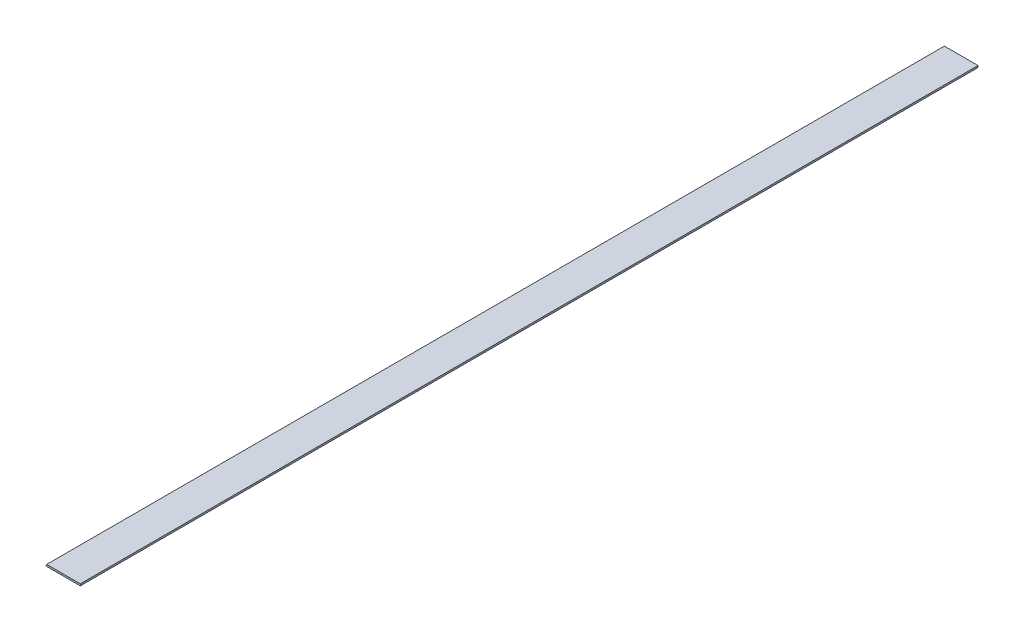
ISO-10303-21;
HEADER;
FILE_DESCRIPTION(('STEP AP214'),'2;1');
FILE_NAME('part.step','',(''),(''),'','','');
FILE_SCHEMA(('AUTOMOTIVE_DESIGN { 1 0 10303 214 1 1 1 1 }'));
ENDSEC;
DATA;
#1=APPLICATION_CONTEXT('core data for automotive mechanical design processes');
#2=APPLICATION_PROTOCOL_DEFINITION('international standard','automotive_design',2000,#1);
#3=PRODUCT_CONTEXT('',#1,'mechanical');
#4=PRODUCT('Part','Part','',(#3));
#5=PRODUCT_RELATED_PRODUCT_CATEGORY('part','',(#4));
#6=PRODUCT_DEFINITION_FORMATION('','',#4);
#7=PRODUCT_DEFINITION_CONTEXT('part definition',#1,'design');
#8=PRODUCT_DEFINITION('design','',#6,#7);
#9=PRODUCT_DEFINITION_SHAPE('','',#8);
#10=(LENGTH_UNIT() NAMED_UNIT(*) SI_UNIT(.MILLI.,.METRE.));
#11=(NAMED_UNIT(*) PLANE_ANGLE_UNIT() SI_UNIT($,.RADIAN.));
#12=(NAMED_UNIT(*) SI_UNIT($,.STERADIAN.) SOLID_ANGLE_UNIT());
#13=UNCERTAINTY_MEASURE_WITH_UNIT(LENGTH_MEASURE(1.E-05),#10,'distance_accuracy_value','');
#14=(GEOMETRIC_REPRESENTATION_CONTEXT(3) GLOBAL_UNCERTAINTY_ASSIGNED_CONTEXT((#13)) GLOBAL_UNIT_ASSIGNED_CONTEXT((#10,
#11,#12)) REPRESENTATION_CONTEXT('',''));
#15=CARTESIAN_POINT('',(0.,0.,0.));
#16=DIRECTION('',(0.,0.,1.));
#17=DIRECTION('',(1.,0.,0.));
#18=AXIS2_PLACEMENT_3D('',#15,#16,#17);
#19=CARTESIAN_POINT('',(0.872804829166851,-0.33319147550627,501.999999999994));
#20=DIRECTION('',(-0.934240241676248,0.356644319781934,0.));
#21=DIRECTION('',(-0.356644319781916,-0.934240241676297,0.));
#22=AXIS2_PLACEMENT_3D('',#19,#20,#21);
#23=PLANE('',#22);
#24=DIRECTION('',(0.356644319781916,0.934240241676297,0.));
#25=VECTOR('',#24,1.);
#26=CARTESIAN_POINT('',(0.872804829167295,-0.333191475507616,0.));
#27=LINE('',#26,#25);
#28=CARTESIAN_POINT('',(0.99999999999989,0.,0.));
#29=VERTEX_POINT('',#28);
#30=CARTESIAN_POINT('',(1.38174797431345,0.999999999997919,3.88578058618805E-13));
#31=VERTEX_POINT('',#30);
#32=EDGE_CURVE('E100',#29,#31,#27,.T.);
#33=ORIENTED_EDGE('',*,*,#32,.F.);
#34=DIRECTION('',(0.,0.,-0.99999999999999));
#35=VECTOR('',#34,1.);
#36=CARTESIAN_POINT('',(0.999999999999446,0.,501.999999999997));
#37=LINE('',#36,#35);
#38=CARTESIAN_POINT('',(0.999999999999446,0.,501.999999999997));
#39=VERTEX_POINT('',#38);
#40=EDGE_CURVE('E11',#39,#29,#37,.T.);
#41=ORIENTED_EDGE('',*,*,#40,.F.);
#42=DIRECTION('',(0.356644319781916,0.934240241676297,0.));
#43=VECTOR('',#42,1.);
#44=CARTESIAN_POINT('',(0.872804829166851,-0.33319147550627,501.999999999994));
#45=LINE('',#44,#43);
#46=CARTESIAN_POINT('',(1.38174797431279,0.999999999998585,501.999999999993));
#47=VERTEX_POINT('',#46);
#48=EDGE_CURVE('E92',#39,#47,#45,.T.);
#49=ORIENTED_EDGE('',*,*,#48,.T.);
#50=DIRECTION('',(0.,0.,-0.99999999999999));
#51=VECTOR('',#50,1.);
#52=CARTESIAN_POINT('',(1.38174797431279,0.999999999998585,501.999999999993));
#53=LINE('',#52,#51);
#54=EDGE_CURVE('E53',#47,#31,#53,.T.);
#55=ORIENTED_EDGE('',*,*,#54,.T.);
#56=EDGE_LOOP('',(#33,#41,#49,#55));
#57=FACE_BOUND('',#56,.T.);
#58=ADVANCED_FACE('F37',(#57),#23,.T.);
#59=CARTESIAN_POINT('',(-4.44089209850063E-13,0.,501.999999999997));
#60=DIRECTION('',(0.,-1.00000000000005,0.));
#61=DIRECTION('',(1.,0.,0.));
#62=AXIS2_PLACEMENT_3D('',#59,#60,#61);
#63=PLANE('',#62);
#64=DIRECTION('',(-1.,0.,0.));
#65=VECTOR('',#64,1.);
#66=CARTESIAN_POINT('',(0.,0.,0.));
#67=LINE('',#66,#65);
#68=CARTESIAN_POINT('',(20.1917479743134,0.,-3.88578058618805E-13));
#69=VERTEX_POINT('',#68);
#70=EDGE_CURVE('E83',#69,#29,#67,.T.);
#71=ORIENTED_EDGE('',*,*,#70,.F.);
#72=DIRECTION('',(0.,0.,-0.99999999999999));
#73=VECTOR('',#72,1.);
#74=CARTESIAN_POINT('',(20.1917479743128,2.08166817117217E-13,501.999999999995));
#75=LINE('',#74,#73);
#76=CARTESIAN_POINT('',(20.1917479743128,2.08166817117217E-13,501.999999999995));
#77=VERTEX_POINT('',#76);
#78=EDGE_CURVE('E45',#77,#69,#75,.T.);
#79=ORIENTED_EDGE('',*,*,#78,.F.);
#80=DIRECTION('',(-1.,0.,0.));
#81=VECTOR('',#80,1.);
#82=CARTESIAN_POINT('',(-4.44089209850063E-13,0.,501.999999999997));
#83=LINE('',#82,#81);
#84=EDGE_CURVE('E81',#77,#39,#83,.T.);
#85=ORIENTED_EDGE('',*,*,#84,.T.);
#86=ORIENTED_EDGE('',*,*,#40,.T.);
#87=EDGE_LOOP('',(#71,#79,#85,#86));
#88=FACE_BOUND('',#87,.T.);
#89=ADVANCED_FACE('F80',(#88),#63,.T.);
#90=CARTESIAN_POINT('',(20.1917479743128,2.08166817117217E-13,501.999999999995));
#91=DIRECTION('',(1.,0.,0.));
#92=DIRECTION('',(0.,0.,-0.99999999999999));
#93=AXIS2_PLACEMENT_3D('',#90,#91,#92);
#94=PLANE('',#93);
#95=DIRECTION('',(0.,-1.00000000000005,0.));
#96=VECTOR('',#95,1.);
#97=CARTESIAN_POINT('',(20.1917479743134,0.,-3.88578058618805E-13));
#98=LINE('',#97,#96);
#99=CARTESIAN_POINT('',(20.1917479743134,0.999999999998114,3.33066907387547E-13));
#100=VERTEX_POINT('',#99);
#101=EDGE_CURVE('E103',#100,#69,#98,.T.);
#102=ORIENTED_EDGE('',*,*,#101,.F.);
#103=DIRECTION('',(0.,0.,-0.99999999999999));
#104=VECTOR('',#103,1.);
#105=CARTESIAN_POINT('',(20.1917479743128,0.999999999999016,501.999999999994));
#106=LINE('',#105,#104);
#107=CARTESIAN_POINT('',(20.1917479743128,0.999999999999016,501.999999999994));
#108=VERTEX_POINT('',#107);
#109=EDGE_CURVE('E66',#108,#100,#106,.T.);
#110=ORIENTED_EDGE('',*,*,#109,.F.);
#111=DIRECTION('',(0.,-1.00000000000005,0.));
#112=VECTOR('',#111,1.);
#113=CARTESIAN_POINT('',(20.1917479743128,2.08166817117217E-13,501.999999999995));
#114=LINE('',#113,#112);
#115=EDGE_CURVE('E91',#108,#77,#114,.T.);
#116=ORIENTED_EDGE('',*,*,#115,.T.);
#117=ORIENTED_EDGE('',*,*,#78,.T.);
#118=EDGE_LOOP('',(#102,#110,#116,#117));
#119=FACE_BOUND('',#118,.T.);
#120=ADVANCED_FACE('F94',(#119),#94,.T.);
#121=CARTESIAN_POINT('',(-4.44089209850063E-13,0.999999999999251,501.999999999995));
#122=DIRECTION('',(0.,1.00000000000005,0.));
#123=DIRECTION('',(-1.,0.,0.));
#124=AXIS2_PLACEMENT_3D('',#121,#122,#123);
#125=PLANE('',#124);
#126=DIRECTION('',(1.,0.,0.));
#127=VECTOR('',#126,1.);
#128=CARTESIAN_POINT('',(0.,0.999999999997919,3.88578058618805E-13));
#129=LINE('',#128,#127);
#130=EDGE_CURVE('E105',#31,#100,#129,.T.);
#131=ORIENTED_EDGE('',*,*,#130,.F.);
#132=ORIENTED_EDGE('',*,*,#54,.F.);
#133=DIRECTION('',(1.,0.,0.));
#134=VECTOR('',#133,1.);
#135=CARTESIAN_POINT('',(-4.44089209850063E-13,0.999999999999251,501.999999999995));
#136=LINE('',#135,#134);
#137=EDGE_CURVE('E95',#47,#108,#136,.T.);
#138=ORIENTED_EDGE('',*,*,#137,.T.);
#139=ORIENTED_EDGE('',*,*,#109,.T.);
#140=EDGE_LOOP('',(#131,#132,#138,#139));
#141=FACE_BOUND('',#140,.T.);
#142=ADVANCED_FACE('F110',(#141),#125,.T.);
#143=CARTESIAN_POINT('',(-4.44089209850063E-13,0.,501.999999999997));
#144=DIRECTION('',(0.,0.,0.99999999999999));
#145=DIRECTION('',(1.,0.,0.));
#146=AXIS2_PLACEMENT_3D('',#143,#144,#145);
#147=PLANE('',#146);
#148=ORIENTED_EDGE('',*,*,#48,.F.);
#149=ORIENTED_EDGE('',*,*,#84,.F.);
#150=ORIENTED_EDGE('',*,*,#115,.F.);
#151=ORIENTED_EDGE('',*,*,#137,.F.);
#152=EDGE_LOOP('',(#148,#149,#150,#151));
#153=FACE_BOUND('',#152,.T.);
#154=ADVANCED_FACE('F89',(#153),#147,.T.);
#155=CARTESIAN_POINT('',(0.,0.,0.));
#156=DIRECTION('',(0.,0.,0.99999999999999));
#157=DIRECTION('',(1.,0.,0.));
#158=AXIS2_PLACEMENT_3D('',#155,#156,#157);
#159=PLANE('',#158);
#160=ORIENTED_EDGE('',*,*,#32,.T.);
#161=ORIENTED_EDGE('',*,*,#130,.T.);
#162=ORIENTED_EDGE('',*,*,#101,.T.);
#163=ORIENTED_EDGE('',*,*,#70,.T.);
#164=EDGE_LOOP('',(#160,#161,#162,#163));
#165=FACE_BOUND('',#164,.T.);
#166=ADVANCED_FACE('F118',(#165),#159,.F.);
#167=CLOSED_SHELL('',(#58,#89,#120,#142,#154,#166));
#168=MANIFOLD_SOLID_BREP('B2',#167);
#169=ADVANCED_BREP_SHAPE_REPRESENTATION('',(#18,#168),#14);
#170=SHAPE_DEFINITION_REPRESENTATION(#9,#169);
ENDSEC;
END-ISO-10303-21;
